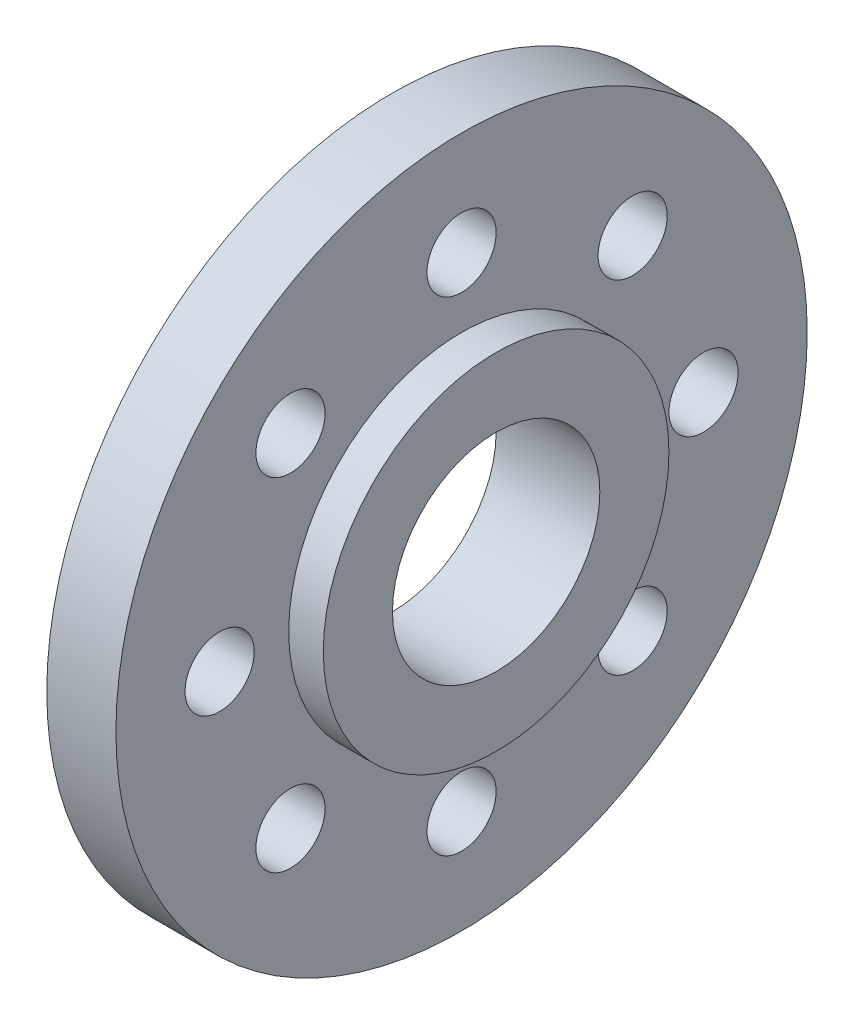
ISO-10303-21;
HEADER;
FILE_DESCRIPTION(('STEP AP214'),'2;1');
FILE_NAME('part.step','',(''),(''),'','','');
FILE_SCHEMA(('AUTOMOTIVE_DESIGN { 1 0 10303 214 1 1 1 1 }'));
ENDSEC;
DATA;
#1=APPLICATION_CONTEXT('core data for automotive mechanical design processes');
#2=APPLICATION_PROTOCOL_DEFINITION('international standard','automotive_design',2000,#1);
#3=PRODUCT_CONTEXT('',#1,'mechanical');
#4=PRODUCT('Part','Part','',(#3));
#5=PRODUCT_RELATED_PRODUCT_CATEGORY('part','',(#4));
#6=PRODUCT_DEFINITION_FORMATION('','',#4);
#7=PRODUCT_DEFINITION_CONTEXT('part definition',#1,'design');
#8=PRODUCT_DEFINITION('design','',#6,#7);
#9=PRODUCT_DEFINITION_SHAPE('','',#8);
#10=(LENGTH_UNIT() NAMED_UNIT(*) SI_UNIT(.MILLI.,.METRE.));
#11=(NAMED_UNIT(*) PLANE_ANGLE_UNIT() SI_UNIT($,.RADIAN.));
#12=(NAMED_UNIT(*) SI_UNIT($,.STERADIAN.) SOLID_ANGLE_UNIT());
#13=UNCERTAINTY_MEASURE_WITH_UNIT(LENGTH_MEASURE(1.E-05),#10,'distance_accuracy_value','');
#14=(GEOMETRIC_REPRESENTATION_CONTEXT(3) GLOBAL_UNCERTAINTY_ASSIGNED_CONTEXT((#13)) GLOBAL_UNIT_ASSIGNED_CONTEXT((#10,
#11,#12)) REPRESENTATION_CONTEXT('',''));
#15=CARTESIAN_POINT('',(0.,0.,0.));
#16=DIRECTION('',(0.,0.,1.));
#17=DIRECTION('',(1.,0.,0.));
#18=AXIS2_PLACEMENT_3D('',#15,#16,#17);
#19=CARTESIAN_POINT('',(2.,0.,0.));
#20=DIRECTION('',(1.,0.,0.));
#21=DIRECTION('',(0.,0.,-1.));
#22=AXIS2_PLACEMENT_3D('',#19,#20,#21);
#23=PLANE('',#22);
#24=CARTESIAN_POINT('',(2.,4.94974746830589,-4.94974746830577));
#25=DIRECTION('',(1.,0.,0.));
#26=DIRECTION('',(0.,0.,-1.));
#27=AXIS2_PLACEMENT_3D('',#24,#25,#26);
#28=CIRCLE('',#27,1.);
#29=CARTESIAN_POINT('',(2.,4.94974746830589,-5.94974746830577));
#30=VERTEX_POINT('',#29);
#31=EDGE_CURVE('E98',#30,#30,#28,.T.);
#32=ORIENTED_EDGE('',*,*,#31,.F.);
#33=EDGE_LOOP('',(#32));
#34=FACE_BOUND('',#33,.T.);
#35=CARTESIAN_POINT('',(2.,0.,-7.));
#36=DIRECTION('',(1.,0.,0.));
#37=DIRECTION('',(0.,0.,-1.));
#38=AXIS2_PLACEMENT_3D('',#35,#36,#37);
#39=CIRCLE('',#38,1.);
#40=CARTESIAN_POINT('',(2.,0.,-8.));
#41=VERTEX_POINT('',#40);
#42=EDGE_CURVE('E92',#41,#41,#39,.T.);
#43=ORIENTED_EDGE('',*,*,#42,.F.);
#44=EDGE_LOOP('',(#43));
#45=FACE_BOUND('',#44,.T.);
#46=CARTESIAN_POINT('',(2.,-4.94974746830579,-4.94974746830588));
#47=DIRECTION('',(1.,0.,0.));
#48=DIRECTION('',(0.,0.,-1.));
#49=AXIS2_PLACEMENT_3D('',#46,#47,#48);
#50=CIRCLE('',#49,1.);
#51=CARTESIAN_POINT('',(2.,-4.94974746830579,-5.94974746830588));
#52=VERTEX_POINT('',#51);
#53=EDGE_CURVE('E86',#52,#52,#50,.T.);
#54=ORIENTED_EDGE('',*,*,#53,.F.);
#55=EDGE_LOOP('',(#54));
#56=FACE_BOUND('',#55,.T.);
#57=CARTESIAN_POINT('',(2.,-7.,0.));
#58=DIRECTION('',(1.,0.,0.));
#59=DIRECTION('',(0.,0.,-1.));
#60=AXIS2_PLACEMENT_3D('',#57,#58,#59);
#61=CIRCLE('',#60,1.);
#62=CARTESIAN_POINT('',(2.,-7.,-1.));
#63=VERTEX_POINT('',#62);
#64=EDGE_CURVE('E80',#63,#63,#61,.T.);
#65=ORIENTED_EDGE('',*,*,#64,.F.);
#66=EDGE_LOOP('',(#65));
#67=FACE_BOUND('',#66,.T.);
#68=CARTESIAN_POINT('',(2.,-4.94974746830586,4.94974746830581));
#69=DIRECTION('',(1.,0.,0.));
#70=DIRECTION('',(0.,0.,-1.));
#71=AXIS2_PLACEMENT_3D('',#68,#69,#70);
#72=CIRCLE('',#71,1.);
#73=CARTESIAN_POINT('',(2.,-4.94974746830586,3.94974746830581));
#74=VERTEX_POINT('',#73);
#75=EDGE_CURVE('E74',#74,#74,#72,.T.);
#76=ORIENTED_EDGE('',*,*,#75,.F.);
#77=EDGE_LOOP('',(#76));
#78=FACE_BOUND('',#77,.T.);
#79=CARTESIAN_POINT('',(2.,0.,7.));
#80=DIRECTION('',(1.,0.,0.));
#81=DIRECTION('',(0.,0.,-1.));
#82=AXIS2_PLACEMENT_3D('',#79,#80,#81);
#83=CIRCLE('',#82,1.);
#84=CARTESIAN_POINT('',(2.,0.,6.));
#85=VERTEX_POINT('',#84);
#86=EDGE_CURVE('E68',#85,#85,#83,.T.);
#87=ORIENTED_EDGE('',*,*,#86,.F.);
#88=EDGE_LOOP('',(#87));
#89=FACE_BOUND('',#88,.T.);
#90=CARTESIAN_POINT('',(2.,4.94974746830582,4.94974746830584));
#91=DIRECTION('',(1.,0.,0.));
#92=DIRECTION('',(0.,0.,-1.));
#93=AXIS2_PLACEMENT_3D('',#90,#91,#92);
#94=CIRCLE('',#93,1.);
#95=CARTESIAN_POINT('',(2.,4.94974746830582,3.94974746830584));
#96=VERTEX_POINT('',#95);
#97=EDGE_CURVE('E62',#96,#96,#94,.T.);
#98=ORIENTED_EDGE('',*,*,#97,.F.);
#99=EDGE_LOOP('',(#98));
#100=FACE_BOUND('',#99,.T.);
#101=CARTESIAN_POINT('',(2.,7.,0.));
#102=DIRECTION('',(1.,0.,0.));
#103=DIRECTION('',(0.,0.,-1.));
#104=AXIS2_PLACEMENT_3D('',#101,#102,#103);
#105=CIRCLE('',#104,1.);
#106=CARTESIAN_POINT('',(2.,7.,-1.));
#107=VERTEX_POINT('',#106);
#108=EDGE_CURVE('E56',#107,#107,#105,.T.);
#109=ORIENTED_EDGE('',*,*,#108,.F.);
#110=EDGE_LOOP('',(#109));
#111=FACE_BOUND('',#110,.T.);
#112=CARTESIAN_POINT('',(2.,0.,0.));
#113=DIRECTION('',(1.,0.,0.));
#114=DIRECTION('',(0.,0.,-1.));
#115=AXIS2_PLACEMENT_3D('',#112,#113,#114);
#116=CIRCLE('',#115,10.);
#117=CARTESIAN_POINT('',(2.,0.,-10.));
#118=VERTEX_POINT('',#117);
#119=EDGE_CURVE('E10',#118,#118,#116,.T.);
#120=ORIENTED_EDGE('',*,*,#119,.T.);
#121=EDGE_LOOP('',(#120));
#122=FACE_BOUND('',#121,.T.);
#123=CARTESIAN_POINT('',(2.,0.,0.));
#124=DIRECTION('',(1.,0.,0.));
#125=DIRECTION('',(0.,0.,-1.));
#126=AXIS2_PLACEMENT_3D('',#123,#124,#125);
#127=CIRCLE('',#126,5.);
#128=CARTESIAN_POINT('',(2.,0.,-5.));
#129=VERTEX_POINT('',#128);
#130=EDGE_CURVE('E48',#129,#129,#127,.T.);
#131=ORIENTED_EDGE('',*,*,#130,.F.);
#132=EDGE_LOOP('',(#131));
#133=FACE_BOUND('',#132,.T.);
#134=ADVANCED_FACE('F32',(#34,#45,#56,#67,#78,#89,#100,#111,#122,#133),#23,.T.);
#135=CARTESIAN_POINT('',(2.,0.,0.));
#136=DIRECTION('',(-1.,0.,0.));
#137=DIRECTION('',(0.,0.,1.));
#138=AXIS2_PLACEMENT_3D('',#135,#136,#137);
#139=CYLINDRICAL_SURFACE('',#138,10.);
#140=ORIENTED_EDGE('',*,*,#119,.F.);
#141=EDGE_LOOP('',(#140));
#142=FACE_BOUND('',#141,.T.);
#143=CARTESIAN_POINT('',(0.,0.,0.));
#144=DIRECTION('',(1.,0.,0.));
#145=DIRECTION('',(0.,0.,-1.));
#146=AXIS2_PLACEMENT_3D('',#143,#144,#145);
#147=CIRCLE('',#146,10.);
#148=CARTESIAN_POINT('',(0.,0.,-10.));
#149=VERTEX_POINT('',#148);
#150=EDGE_CURVE('E36',#149,#149,#147,.T.);
#151=ORIENTED_EDGE('',*,*,#150,.T.);
#152=EDGE_LOOP('',(#151));
#153=FACE_BOUND('',#152,.T.);
#154=ADVANCED_FACE('F34',(#142,#153),#139,.T.);
#155=CARTESIAN_POINT('',(0.,0.,0.));
#156=DIRECTION('',(1.,0.,0.));
#157=DIRECTION('',(0.,0.,-1.));
#158=AXIS2_PLACEMENT_3D('',#155,#156,#157);
#159=PLANE('',#158);
#160=CARTESIAN_POINT('',(0.,4.94974746830589,-4.94974746830577));
#161=DIRECTION('',(-1.,0.,0.));
#162=DIRECTION('',(0.,0.707106781186539,0.707106781186556));
#163=AXIS2_PLACEMENT_3D('',#160,#161,#162);
#164=CIRCLE('',#163,1.);
#165=CARTESIAN_POINT('',(0.,5.65685424949243,-4.24264068711922));
#166=VERTEX_POINT('',#165);
#167=EDGE_CURVE('E101',#166,#166,#164,.T.);
#168=ORIENTED_EDGE('',*,*,#167,.F.);
#169=EDGE_LOOP('',(#168));
#170=FACE_BOUND('',#169,.T.);
#171=CARTESIAN_POINT('',(0.,0.,-7.));
#172=DIRECTION('',(-1.,0.,0.));
#173=DIRECTION('',(0.,1.,0.));
#174=AXIS2_PLACEMENT_3D('',#171,#172,#173);
#175=CIRCLE('',#174,1.);
#176=CARTESIAN_POINT('',(0.,1.00000000000007,-6.99999999999999));
#177=VERTEX_POINT('',#176);
#178=EDGE_CURVE('E95',#177,#177,#175,.T.);
#179=ORIENTED_EDGE('',*,*,#178,.F.);
#180=EDGE_LOOP('',(#179));
#181=FACE_BOUND('',#180,.T.);
#182=CARTESIAN_POINT('',(0.,-4.94974746830579,-4.94974746830588));
#183=DIRECTION('',(-1.,0.,0.));
#184=DIRECTION('',(0.,0.707106781186554,-0.707106781186541));
#185=AXIS2_PLACEMENT_3D('',#182,#183,#184);
#186=CIRCLE('',#185,1.);
#187=CARTESIAN_POINT('',(0.,-4.24264068711924,-5.65685424949242));
#188=VERTEX_POINT('',#187);
#189=EDGE_CURVE('E89',#188,#188,#186,.T.);
#190=ORIENTED_EDGE('',*,*,#189,.F.);
#191=EDGE_LOOP('',(#190));
#192=FACE_BOUND('',#191,.T.);
#193=CARTESIAN_POINT('',(0.,-7.,0.));
#194=DIRECTION('',(-1.,0.,0.));
#195=DIRECTION('',(0.,0.,-1.));
#196=AXIS2_PLACEMENT_3D('',#193,#194,#195);
#197=CIRCLE('',#196,1.);
#198=CARTESIAN_POINT('',(0.,-7.,-1.));
#199=VERTEX_POINT('',#198);
#200=EDGE_CURVE('E83',#199,#199,#197,.T.);
#201=ORIENTED_EDGE('',*,*,#200,.F.);
#202=EDGE_LOOP('',(#201));
#203=FACE_BOUND('',#202,.T.);
#204=CARTESIAN_POINT('',(0.,-4.94974746830586,4.94974746830581));
#205=DIRECTION('',(-1.,0.,0.));
#206=DIRECTION('',(0.,-0.707106781186544,-0.707106781186551));
#207=AXIS2_PLACEMENT_3D('',#204,#205,#206);
#208=CIRCLE('',#207,1.);
#209=CARTESIAN_POINT('',(0.,-5.6568542494924,4.24264068711926));
#210=VERTEX_POINT('',#209);
#211=EDGE_CURVE('E77',#210,#210,#208,.T.);
#212=ORIENTED_EDGE('',*,*,#211,.F.);
#213=EDGE_LOOP('',(#212));
#214=FACE_BOUND('',#213,.T.);
#215=CARTESIAN_POINT('',(0.,0.,7.));
#216=DIRECTION('',(-1.,0.,0.));
#217=DIRECTION('',(0.,-1.,0.));
#218=AXIS2_PLACEMENT_3D('',#215,#216,#217);
#219=CIRCLE('',#218,1.);
#220=CARTESIAN_POINT('',(0.,-1.00000000000002,7.));
#221=VERTEX_POINT('',#220);
#222=EDGE_CURVE('E71',#221,#221,#219,.T.);
#223=ORIENTED_EDGE('',*,*,#222,.F.);
#224=EDGE_LOOP('',(#223));
#225=FACE_BOUND('',#224,.T.);
#226=CARTESIAN_POINT('',(0.,4.94974746830582,4.94974746830584));
#227=DIRECTION('',(-1.,0.,0.));
#228=DIRECTION('',(0.,-0.707106781186549,0.707106781186546));
#229=AXIS2_PLACEMENT_3D('',#226,#227,#228);
#230=CIRCLE('',#229,1.);
#231=CARTESIAN_POINT('',(0.,4.24264068711928,5.65685424949239));
#232=VERTEX_POINT('',#231);
#233=EDGE_CURVE('E65',#232,#232,#230,.T.);
#234=ORIENTED_EDGE('',*,*,#233,.F.);
#235=EDGE_LOOP('',(#234));
#236=FACE_BOUND('',#235,.T.);
#237=CARTESIAN_POINT('',(0.,7.,0.));
#238=DIRECTION('',(-1.,0.,0.));
#239=DIRECTION('',(0.,0.,1.));
#240=AXIS2_PLACEMENT_3D('',#237,#238,#239);
#241=CIRCLE('',#240,1.);
#242=CARTESIAN_POINT('',(0.,7.,1.));
#243=VERTEX_POINT('',#242);
#244=EDGE_CURVE('E59',#243,#243,#241,.T.);
#245=ORIENTED_EDGE('',*,*,#244,.F.);
#246=EDGE_LOOP('',(#245));
#247=FACE_BOUND('',#246,.T.);
#248=CARTESIAN_POINT('',(0.,0.,0.));
#249=DIRECTION('',(1.,0.,0.));
#250=DIRECTION('',(0.,0.,-1.));
#251=AXIS2_PLACEMENT_3D('',#248,#249,#250);
#252=CIRCLE('',#251,3.);
#253=CARTESIAN_POINT('',(0.,0.,-3.));
#254=VERTEX_POINT('',#253);
#255=EDGE_CURVE('E43',#254,#254,#252,.T.);
#256=ORIENTED_EDGE('',*,*,#255,.T.);
#257=EDGE_LOOP('',(#256));
#258=FACE_BOUND('',#257,.T.);
#259=ORIENTED_EDGE('',*,*,#150,.F.);
#260=EDGE_LOOP('',(#259));
#261=FACE_BOUND('',#260,.T.);
#262=ADVANCED_FACE('F107',(#170,#181,#192,#203,#214,#225,#236,#247,#258,#261),#159,.F.);
#263=CARTESIAN_POINT('',(0.,0.,0.));
#264=DIRECTION('',(1.,0.,0.));
#265=DIRECTION('',(0.,0.,-1.));
#266=AXIS2_PLACEMENT_3D('',#263,#264,#265);
#267=CYLINDRICAL_SURFACE('',#266,3.);
#268=ORIENTED_EDGE('',*,*,#255,.F.);
#269=EDGE_LOOP('',(#268));
#270=FACE_BOUND('',#269,.T.);
#271=CARTESIAN_POINT('',(3.,0.,0.));
#272=DIRECTION('',(1.,0.,0.));
#273=DIRECTION('',(0.,0.,-1.));
#274=AXIS2_PLACEMENT_3D('',#271,#272,#273);
#275=CIRCLE('',#274,3.);
#276=CARTESIAN_POINT('',(3.,0.,-3.));
#277=VERTEX_POINT('',#276);
#278=EDGE_CURVE('E51',#277,#277,#275,.T.);
#279=ORIENTED_EDGE('',*,*,#278,.T.);
#280=EDGE_LOOP('',(#279));
#281=FACE_BOUND('',#280,.T.);
#282=ADVANCED_FACE('F110',(#270,#281),#267,.F.);
#283=CARTESIAN_POINT('',(3.,0.,0.));
#284=DIRECTION('',(1.,0.,0.));
#285=DIRECTION('',(0.,0.,-1.));
#286=AXIS2_PLACEMENT_3D('',#283,#284,#285);
#287=PLANE('',#286);
#288=CARTESIAN_POINT('',(3.,0.,0.));
#289=DIRECTION('',(1.,0.,0.));
#290=DIRECTION('',(0.,0.,-1.));
#291=AXIS2_PLACEMENT_3D('',#288,#289,#290);
#292=CIRCLE('',#291,5.);
#293=CARTESIAN_POINT('',(3.,0.,-5.));
#294=VERTEX_POINT('',#293);
#295=EDGE_CURVE('E47',#294,#294,#292,.T.);
#296=ORIENTED_EDGE('',*,*,#295,.T.);
#297=EDGE_LOOP('',(#296));
#298=FACE_BOUND('',#297,.T.);
#299=ORIENTED_EDGE('',*,*,#278,.F.);
#300=EDGE_LOOP('',(#299));
#301=FACE_BOUND('',#300,.T.);
#302=ADVANCED_FACE('F143',(#298,#301),#287,.T.);
#303=CARTESIAN_POINT('',(3.,0.,0.));
#304=DIRECTION('',(-1.,0.,0.));
#305=DIRECTION('',(0.,0.,1.));
#306=AXIS2_PLACEMENT_3D('',#303,#304,#305);
#307=CYLINDRICAL_SURFACE('',#306,5.);
#308=ORIENTED_EDGE('',*,*,#295,.F.);
#309=EDGE_LOOP('',(#308));
#310=FACE_BOUND('',#309,.T.);
#311=ORIENTED_EDGE('',*,*,#130,.T.);
#312=EDGE_LOOP('',(#311));
#313=FACE_BOUND('',#312,.T.);
#314=ADVANCED_FACE('F145',(#310,#313),#307,.T.);
#315=CARTESIAN_POINT('',(3.,7.,0.));
#316=DIRECTION('',(-1.,0.,0.));
#317=DIRECTION('',(0.,0.,1.));
#318=AXIS2_PLACEMENT_3D('',#315,#316,#317);
#319=CYLINDRICAL_SURFACE('',#318,1.);
#320=ORIENTED_EDGE('',*,*,#108,.T.);
#321=EDGE_LOOP('',(#320));
#322=FACE_BOUND('',#321,.T.);
#323=ORIENTED_EDGE('',*,*,#244,.T.);
#324=EDGE_LOOP('',(#323));
#325=FACE_BOUND('',#324,.T.);
#326=ADVANCED_FACE('F148',(#322,#325),#319,.F.);
#327=CARTESIAN_POINT('',(3.,4.94974746830582,4.94974746830584));
#328=DIRECTION('',(-1.,0.,0.));
#329=DIRECTION('',(0.,0.,1.));
#330=AXIS2_PLACEMENT_3D('',#327,#328,#329);
#331=CYLINDRICAL_SURFACE('',#330,1.);
#332=ORIENTED_EDGE('',*,*,#97,.T.);
#333=EDGE_LOOP('',(#332));
#334=FACE_BOUND('',#333,.T.);
#335=ORIENTED_EDGE('',*,*,#233,.T.);
#336=EDGE_LOOP('',(#335));
#337=FACE_BOUND('',#336,.T.);
#338=ADVANCED_FACE('F155',(#334,#337),#331,.F.);
#339=CARTESIAN_POINT('',(3.,0.,7.));
#340=DIRECTION('',(-1.,0.,0.));
#341=DIRECTION('',(0.,0.,1.));
#342=AXIS2_PLACEMENT_3D('',#339,#340,#341);
#343=CYLINDRICAL_SURFACE('',#342,1.);
#344=ORIENTED_EDGE('',*,*,#86,.T.);
#345=EDGE_LOOP('',(#344));
#346=FACE_BOUND('',#345,.T.);
#347=ORIENTED_EDGE('',*,*,#222,.T.);
#348=EDGE_LOOP('',(#347));
#349=FACE_BOUND('',#348,.T.);
#350=ADVANCED_FACE('F159',(#346,#349),#343,.F.);
#351=CARTESIAN_POINT('',(3.,-4.94974746830586,4.94974746830581));
#352=DIRECTION('',(-1.,0.,0.));
#353=DIRECTION('',(0.,0.,1.));
#354=AXIS2_PLACEMENT_3D('',#351,#352,#353);
#355=CYLINDRICAL_SURFACE('',#354,1.);
#356=ORIENTED_EDGE('',*,*,#75,.T.);
#357=EDGE_LOOP('',(#356));
#358=FACE_BOUND('',#357,.T.);
#359=ORIENTED_EDGE('',*,*,#211,.T.);
#360=EDGE_LOOP('',(#359));
#361=FACE_BOUND('',#360,.T.);
#362=ADVANCED_FACE('F163',(#358,#361),#355,.F.);
#363=CARTESIAN_POINT('',(3.,-7.,0.));
#364=DIRECTION('',(-1.,0.,0.));
#365=DIRECTION('',(0.,0.,1.));
#366=AXIS2_PLACEMENT_3D('',#363,#364,#365);
#367=CYLINDRICAL_SURFACE('',#366,1.);
#368=ORIENTED_EDGE('',*,*,#64,.T.);
#369=EDGE_LOOP('',(#368));
#370=FACE_BOUND('',#369,.T.);
#371=ORIENTED_EDGE('',*,*,#200,.T.);
#372=EDGE_LOOP('',(#371));
#373=FACE_BOUND('',#372,.T.);
#374=ADVANCED_FACE('F167',(#370,#373),#367,.F.);
#375=CARTESIAN_POINT('',(3.,-4.94974746830579,-4.94974746830588));
#376=DIRECTION('',(-1.,0.,0.));
#377=DIRECTION('',(0.,0.,1.));
#378=AXIS2_PLACEMENT_3D('',#375,#376,#377);
#379=CYLINDRICAL_SURFACE('',#378,1.);
#380=ORIENTED_EDGE('',*,*,#53,.T.);
#381=EDGE_LOOP('',(#380));
#382=FACE_BOUND('',#381,.T.);
#383=ORIENTED_EDGE('',*,*,#189,.T.);
#384=EDGE_LOOP('',(#383));
#385=FACE_BOUND('',#384,.T.);
#386=ADVANCED_FACE('F171',(#382,#385),#379,.F.);
#387=CARTESIAN_POINT('',(3.,0.,-7.));
#388=DIRECTION('',(-1.,0.,0.));
#389=DIRECTION('',(0.,0.,1.));
#390=AXIS2_PLACEMENT_3D('',#387,#388,#389);
#391=CYLINDRICAL_SURFACE('',#390,1.);
#392=ORIENTED_EDGE('',*,*,#42,.T.);
#393=EDGE_LOOP('',(#392));
#394=FACE_BOUND('',#393,.T.);
#395=ORIENTED_EDGE('',*,*,#178,.T.);
#396=EDGE_LOOP('',(#395));
#397=FACE_BOUND('',#396,.T.);
#398=ADVANCED_FACE('F175',(#394,#397),#391,.F.);
#399=CARTESIAN_POINT('',(3.,4.94974746830589,-4.94974746830577));
#400=DIRECTION('',(-1.,0.,0.));
#401=DIRECTION('',(0.,0.,1.));
#402=AXIS2_PLACEMENT_3D('',#399,#400,#401);
#403=CYLINDRICAL_SURFACE('',#402,1.);
#404=ORIENTED_EDGE('',*,*,#31,.T.);
#405=EDGE_LOOP('',(#404));
#406=FACE_BOUND('',#405,.T.);
#407=ORIENTED_EDGE('',*,*,#167,.T.);
#408=EDGE_LOOP('',(#407));
#409=FACE_BOUND('',#408,.T.);
#410=ADVANCED_FACE('F105',(#406,#409),#403,.F.);
#411=CLOSED_SHELL('',(#134,#154,#262,#282,#302,#314,#326,#338,#350,#362,#374,#386,#398,#410));
#412=MANIFOLD_SOLID_BREP('B2',#411);
#413=ADVANCED_BREP_SHAPE_REPRESENTATION('',(#18,#412),#14);
#414=SHAPE_DEFINITION_REPRESENTATION(#9,#413);
ENDSEC;
END-ISO-10303-21;
